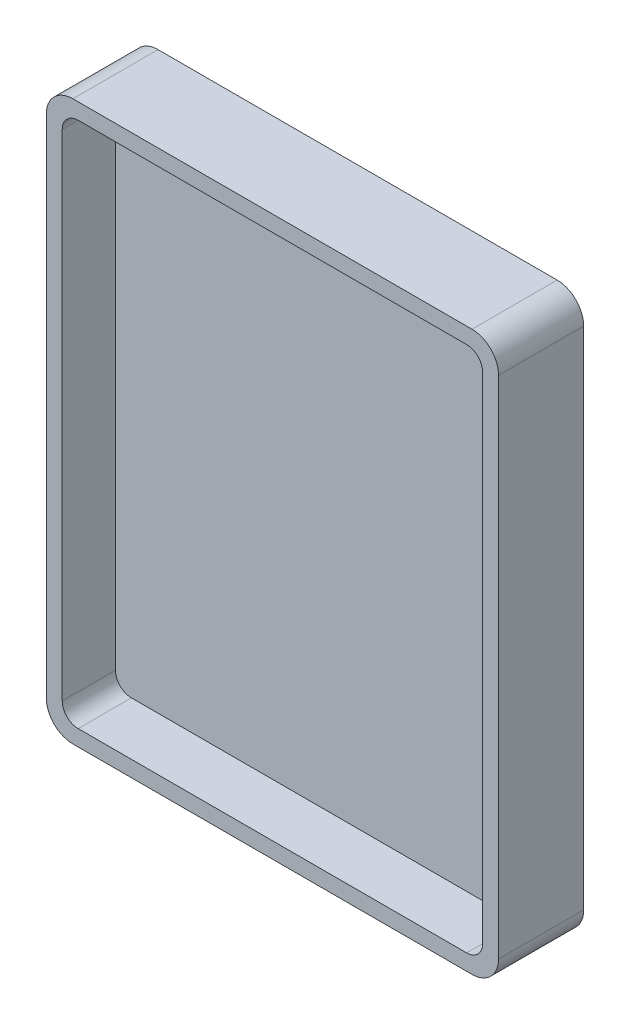
ISO-10303-21;
HEADER;
FILE_DESCRIPTION(('STEP AP214'),'2;1');
FILE_NAME('part.step','',(''),(''),'','','');
FILE_SCHEMA(('AUTOMOTIVE_DESIGN { 1 0 10303 214 1 1 1 1 }'));
ENDSEC;
DATA;
#1=APPLICATION_CONTEXT('core data for automotive mechanical design processes');
#2=APPLICATION_PROTOCOL_DEFINITION('international standard','automotive_design',2000,#1);
#3=PRODUCT_CONTEXT('',#1,'mechanical');
#4=PRODUCT('Part','Part','',(#3));
#5=PRODUCT_RELATED_PRODUCT_CATEGORY('part','',(#4));
#6=PRODUCT_DEFINITION_FORMATION('','',#4);
#7=PRODUCT_DEFINITION_CONTEXT('part definition',#1,'design');
#8=PRODUCT_DEFINITION('design','',#6,#7);
#9=PRODUCT_DEFINITION_SHAPE('','',#8);
#10=(LENGTH_UNIT() NAMED_UNIT(*) SI_UNIT(.MILLI.,.METRE.));
#11=(NAMED_UNIT(*) PLANE_ANGLE_UNIT() SI_UNIT($,.RADIAN.));
#12=(NAMED_UNIT(*) SI_UNIT($,.STERADIAN.) SOLID_ANGLE_UNIT());
#13=UNCERTAINTY_MEASURE_WITH_UNIT(LENGTH_MEASURE(1.E-05),#10,'distance_accuracy_value','');
#14=(GEOMETRIC_REPRESENTATION_CONTEXT(3) GLOBAL_UNCERTAINTY_ASSIGNED_CONTEXT((#13)) GLOBAL_UNIT_ASSIGNED_CONTEXT((#10,
#11,#12)) REPRESENTATION_CONTEXT('',''));
#15=CARTESIAN_POINT('',(0.,0.,0.));
#16=DIRECTION('',(0.,0.,1.));
#17=DIRECTION('',(1.,0.,0.));
#18=AXIS2_PLACEMENT_3D('',#15,#16,#17);
#19=CARTESIAN_POINT('',(-55.,65.,16.));
#20=DIRECTION('',(1.,0.,0.));
#21=DIRECTION('',(0.,1.,0.));
#22=AXIS2_PLACEMENT_3D('',#19,#20,#21);
#23=PLANE('',#22);
#24=DIRECTION('',(0.,-1.,0.));
#25=VECTOR('',#24,1.);
#26=CARTESIAN_POINT('',(-55.,65.,16.));
#27=LINE('',#26,#25);
#28=CARTESIAN_POINT('',(-55.,60.,16.));
#29=VERTEX_POINT('',#28);
#30=CARTESIAN_POINT('',(-55.,-35.,16.));
#31=VERTEX_POINT('',#30);
#32=EDGE_CURVE('E194',#29,#31,#27,.T.);
#33=ORIENTED_EDGE('',*,*,#32,.F.);
#34=DIRECTION('',(0.,0.,-1.));
#35=VECTOR('',#34,1.);
#36=CARTESIAN_POINT('',(-55.,60.,16.));
#37=LINE('',#36,#35);
#38=CARTESIAN_POINT('',(-55.,60.,0.));
#39=VERTEX_POINT('',#38);
#40=EDGE_CURVE('E237',#29,#39,#37,.T.);
#41=ORIENTED_EDGE('',*,*,#40,.T.);
#42=DIRECTION('',(0.,-1.,0.));
#43=VECTOR('',#42,1.);
#44=CARTESIAN_POINT('',(-55.,65.,0.));
#45=LINE('',#44,#43);
#46=CARTESIAN_POINT('',(-55.,-35.,0.));
#47=VERTEX_POINT('',#46);
#48=EDGE_CURVE('E196',#39,#47,#45,.T.);
#49=ORIENTED_EDGE('',*,*,#48,.T.);
#50=DIRECTION('',(0.,0.,-1.));
#51=VECTOR('',#50,1.);
#52=CARTESIAN_POINT('',(-55.,-35.,16.));
#53=LINE('',#52,#51);
#54=EDGE_CURVE('E234',#47,#31,#53,.F.);
#55=ORIENTED_EDGE('',*,*,#54,.T.);
#56=EDGE_LOOP('',(#33,#41,#49,#55));
#57=FACE_BOUND('',#56,.T.);
#58=ADVANCED_FACE('F46',(#57),#23,.F.);
#59=CARTESIAN_POINT('',(-55.,-40.,16.));
#60=DIRECTION('',(0.,1.,0.));
#61=DIRECTION('',(0.,0.,1.));
#62=AXIS2_PLACEMENT_3D('',#59,#60,#61);
#63=PLANE('',#62);
#64=DIRECTION('',(1.,0.,0.));
#65=VECTOR('',#64,1.);
#66=CARTESIAN_POINT('',(-55.,-40.,0.));
#67=LINE('',#66,#65);
#68=CARTESIAN_POINT('',(-50.,-40.,0.));
#69=VERTEX_POINT('',#68);
#70=CARTESIAN_POINT('',(25.,-40.,0.));
#71=VERTEX_POINT('',#70);
#72=EDGE_CURVE('E189',#69,#71,#67,.T.);
#73=ORIENTED_EDGE('',*,*,#72,.T.);
#74=DIRECTION('',(0.,0.,-1.));
#75=VECTOR('',#74,1.);
#76=CARTESIAN_POINT('',(25.,-40.,16.));
#77=LINE('',#76,#75);
#78=CARTESIAN_POINT('',(25.,-40.,16.));
#79=VERTEX_POINT('',#78);
#80=EDGE_CURVE('E164',#71,#79,#77,.F.);
#81=ORIENTED_EDGE('',*,*,#80,.T.);
#82=DIRECTION('',(1.,0.,0.));
#83=VECTOR('',#82,1.);
#84=CARTESIAN_POINT('',(-55.,-40.,16.));
#85=LINE('',#84,#83);
#86=CARTESIAN_POINT('',(-50.,-40.,16.));
#87=VERTEX_POINT('',#86);
#88=EDGE_CURVE('E301',#87,#79,#85,.T.);
#89=ORIENTED_EDGE('',*,*,#88,.F.);
#90=DIRECTION('',(0.,0.,-1.));
#91=VECTOR('',#90,1.);
#92=CARTESIAN_POINT('',(-50.,-40.,16.));
#93=LINE('',#92,#91);
#94=EDGE_CURVE('E170',#87,#69,#93,.T.);
#95=ORIENTED_EDGE('',*,*,#94,.T.);
#96=EDGE_LOOP('',(#73,#81,#89,#95));
#97=FACE_BOUND('',#96,.T.);
#98=ADVANCED_FACE('F421',(#97),#63,.F.);
#99=CARTESIAN_POINT('',(30.,65.,16.));
#100=DIRECTION('',(-1.,0.,0.));
#101=DIRECTION('',(0.,-1.,0.));
#102=AXIS2_PLACEMENT_3D('',#99,#100,#101);
#103=PLANE('',#102);
#104=DIRECTION('',(0.,1.,0.));
#105=VECTOR('',#104,1.);
#106=CARTESIAN_POINT('',(30.,65.,16.));
#107=LINE('',#106,#105);
#108=CARTESIAN_POINT('',(30.,-35.,16.));
#109=VERTEX_POINT('',#108);
#110=CARTESIAN_POINT('',(30.,60.,16.));
#111=VERTEX_POINT('',#110);
#112=EDGE_CURVE('E180',#109,#111,#107,.T.);
#113=ORIENTED_EDGE('',*,*,#112,.F.);
#114=DIRECTION('',(0.,0.,-1.));
#115=VECTOR('',#114,1.);
#116=CARTESIAN_POINT('',(30.,-35.,16.));
#117=LINE('',#116,#115);
#118=CARTESIAN_POINT('',(30.,-35.,0.));
#119=VERTEX_POINT('',#118);
#120=EDGE_CURVE('E163',#109,#119,#117,.T.);
#121=ORIENTED_EDGE('',*,*,#120,.T.);
#122=DIRECTION('',(0.,1.,0.));
#123=VECTOR('',#122,1.);
#124=CARTESIAN_POINT('',(30.,65.,0.));
#125=LINE('',#124,#123);
#126=CARTESIAN_POINT('',(30.,60.,0.));
#127=VERTEX_POINT('',#126);
#128=EDGE_CURVE('E177',#119,#127,#125,.T.);
#129=ORIENTED_EDGE('',*,*,#128,.T.);
#130=DIRECTION('',(0.,0.,-1.));
#131=VECTOR('',#130,1.);
#132=CARTESIAN_POINT('',(30.,60.,16.));
#133=LINE('',#132,#131);
#134=EDGE_CURVE('E183',#127,#111,#133,.F.);
#135=ORIENTED_EDGE('',*,*,#134,.T.);
#136=EDGE_LOOP('',(#113,#121,#129,#135));
#137=FACE_BOUND('',#136,.T.);
#138=ADVANCED_FACE('F176',(#137),#103,.F.);
#139=CARTESIAN_POINT('',(-55.,65.,16.));
#140=DIRECTION('',(0.,-1.,0.));
#141=DIRECTION('',(0.,0.,-1.));
#142=AXIS2_PLACEMENT_3D('',#139,#140,#141);
#143=PLANE('',#142);
#144=DIRECTION('',(-1.,0.,0.));
#145=VECTOR('',#144,1.);
#146=CARTESIAN_POINT('',(-55.,65.,16.));
#147=LINE('',#146,#145);
#148=CARTESIAN_POINT('',(25.,65.,16.));
#149=VERTEX_POINT('',#148);
#150=CARTESIAN_POINT('',(-50.,65.,16.));
#151=VERTEX_POINT('',#150);
#152=EDGE_CURVE('E201',#149,#151,#147,.T.);
#153=ORIENTED_EDGE('',*,*,#152,.F.);
#154=DIRECTION('',(0.,0.,-1.));
#155=VECTOR('',#154,1.);
#156=CARTESIAN_POINT('',(25.,65.,16.));
#157=LINE('',#156,#155);
#158=CARTESIAN_POINT('',(25.,65.,0.));
#159=VERTEX_POINT('',#158);
#160=EDGE_CURVE('E230',#149,#159,#157,.T.);
#161=ORIENTED_EDGE('',*,*,#160,.T.);
#162=DIRECTION('',(-1.,0.,0.));
#163=VECTOR('',#162,1.);
#164=CARTESIAN_POINT('',(-55.,65.,0.));
#165=LINE('',#164,#163);
#166=CARTESIAN_POINT('',(-50.,65.,0.));
#167=VERTEX_POINT('',#166);
#168=EDGE_CURVE('E188',#159,#167,#165,.T.);
#169=ORIENTED_EDGE('',*,*,#168,.T.);
#170=DIRECTION('',(0.,0.,-1.));
#171=VECTOR('',#170,1.);
#172=CARTESIAN_POINT('',(-50.,65.,16.));
#173=LINE('',#172,#171);
#174=EDGE_CURVE('E227',#167,#151,#173,.F.);
#175=ORIENTED_EDGE('',*,*,#174,.T.);
#176=EDGE_LOOP('',(#153,#161,#169,#175));
#177=FACE_BOUND('',#176,.T.);
#178=ADVANCED_FACE('F468',(#177),#143,.F.);
#179=CARTESIAN_POINT('',(0.,0.,16.));
#180=DIRECTION('',(0.,0.,1.));
#181=DIRECTION('',(1.,0.,0.));
#182=AXIS2_PLACEMENT_3D('',#179,#180,#181);
#183=PLANE('',#182);
#184=DIRECTION('',(0.,-1.,0.));
#185=VECTOR('',#184,1.);
#186=CARTESIAN_POINT('',(-52.,62.,16.));
#187=LINE('',#186,#185);
#188=CARTESIAN_POINT('',(-52.,59.,16.));
#189=VERTEX_POINT('',#188);
#190=CARTESIAN_POINT('',(-52.,-34.,16.));
#191=VERTEX_POINT('',#190);
#192=EDGE_CURVE('E333',#189,#191,#187,.T.);
#193=ORIENTED_EDGE('',*,*,#192,.F.);
#194=CARTESIAN_POINT('',(-49.,59.,16.));
#195=DIRECTION('',(0.,0.,1.));
#196=DIRECTION('',(1.,0.,0.));
#197=AXIS2_PLACEMENT_3D('',#194,#195,#196);
#198=CIRCLE('',#197,3.);
#199=CARTESIAN_POINT('',(-49.,62.,16.));
#200=VERTEX_POINT('',#199);
#201=EDGE_CURVE('E11',#189,#200,#198,.F.);
#202=ORIENTED_EDGE('',*,*,#201,.T.);
#203=DIRECTION('',(-1.,0.,0.));
#204=VECTOR('',#203,1.);
#205=CARTESIAN_POINT('',(-52.,62.,16.));
#206=LINE('',#205,#204);
#207=CARTESIAN_POINT('',(24.,62.,16.));
#208=VERTEX_POINT('',#207);
#209=EDGE_CURVE('E312',#208,#200,#206,.T.);
#210=ORIENTED_EDGE('',*,*,#209,.F.);
#211=CARTESIAN_POINT('',(24.,59.,16.));
#212=DIRECTION('',(0.,0.,1.));
#213=DIRECTION('',(1.,0.,0.));
#214=AXIS2_PLACEMENT_3D('',#211,#212,#213);
#215=CIRCLE('',#214,3.);
#216=CARTESIAN_POINT('',(27.,59.,16.));
#217=VERTEX_POINT('',#216);
#218=EDGE_CURVE('E290',#208,#217,#215,.F.);
#219=ORIENTED_EDGE('',*,*,#218,.T.);
#220=DIRECTION('',(0.,1.,0.));
#221=VECTOR('',#220,1.);
#222=CARTESIAN_POINT('',(27.,62.,16.));
#223=LINE('',#222,#221);
#224=CARTESIAN_POINT('',(27.,-34.,16.));
#225=VERTEX_POINT('',#224);
#226=EDGE_CURVE('E340',#225,#217,#223,.T.);
#227=ORIENTED_EDGE('',*,*,#226,.F.);
#228=CARTESIAN_POINT('',(24.,-34.,16.));
#229=DIRECTION('',(0.,0.,1.));
#230=DIRECTION('',(1.,0.,0.));
#231=AXIS2_PLACEMENT_3D('',#228,#229,#230);
#232=CIRCLE('',#231,3.);
#233=CARTESIAN_POINT('',(24.,-37.,16.));
#234=VERTEX_POINT('',#233);
#235=EDGE_CURVE('E293',#225,#234,#232,.F.);
#236=ORIENTED_EDGE('',*,*,#235,.T.);
#237=DIRECTION('',(1.,0.,0.));
#238=VECTOR('',#237,1.);
#239=CARTESIAN_POINT('',(-52.,-37.,16.));
#240=LINE('',#239,#238);
#241=CARTESIAN_POINT('',(-49.,-37.,16.));
#242=VERTEX_POINT('',#241);
#243=EDGE_CURVE('E336',#242,#234,#240,.T.);
#244=ORIENTED_EDGE('',*,*,#243,.F.);
#245=CARTESIAN_POINT('',(-49.,-34.,16.));
#246=DIRECTION('',(0.,0.,1.));
#247=DIRECTION('',(1.,0.,0.));
#248=AXIS2_PLACEMENT_3D('',#245,#246,#247);
#249=CIRCLE('',#248,3.);
#250=EDGE_CURVE('E55',#242,#191,#249,.F.);
#251=ORIENTED_EDGE('',*,*,#250,.T.);
#252=EDGE_LOOP('',(#193,#202,#210,#219,#227,#236,#244,#251));
#253=FACE_BOUND('',#252,.T.);
#254=ORIENTED_EDGE('',*,*,#88,.T.);
#255=CARTESIAN_POINT('',(25.,-35.,16.));
#256=DIRECTION('',(0.,0.,1.));
#257=DIRECTION('',(1.,0.,0.));
#258=AXIS2_PLACEMENT_3D('',#255,#256,#257);
#259=CIRCLE('',#258,5.);
#260=EDGE_CURVE('E224',#79,#109,#259,.T.);
#261=ORIENTED_EDGE('',*,*,#260,.T.);
#262=ORIENTED_EDGE('',*,*,#112,.T.);
#263=CARTESIAN_POINT('',(25.,60.,16.));
#264=DIRECTION('',(0.,0.,1.));
#265=DIRECTION('',(1.,0.,0.));
#266=AXIS2_PLACEMENT_3D('',#263,#264,#265);
#267=CIRCLE('',#266,5.);
#268=EDGE_CURVE('E221',#111,#149,#267,.T.);
#269=ORIENTED_EDGE('',*,*,#268,.T.);
#270=ORIENTED_EDGE('',*,*,#152,.T.);
#271=CARTESIAN_POINT('',(-50.,60.,16.));
#272=DIRECTION('',(0.,0.,1.));
#273=DIRECTION('',(1.,0.,0.));
#274=AXIS2_PLACEMENT_3D('',#271,#272,#273);
#275=CIRCLE('',#274,5.);
#276=EDGE_CURVE('E218',#151,#29,#275,.T.);
#277=ORIENTED_EDGE('',*,*,#276,.T.);
#278=ORIENTED_EDGE('',*,*,#32,.T.);
#279=CARTESIAN_POINT('',(-50.,-35.,16.));
#280=DIRECTION('',(0.,0.,1.));
#281=DIRECTION('',(1.,0.,0.));
#282=AXIS2_PLACEMENT_3D('',#279,#280,#281);
#283=CIRCLE('',#282,5.);
#284=EDGE_CURVE('E215',#31,#87,#283,.T.);
#285=ORIENTED_EDGE('',*,*,#284,.T.);
#286=EDGE_LOOP('',(#254,#261,#262,#269,#270,#277,#278,#285));
#287=FACE_BOUND('',#286,.T.);
#288=ADVANCED_FACE('F400',(#253,#287),#183,.T.);
#289=CARTESIAN_POINT('',(0.,0.,0.));
#290=DIRECTION('',(0.,0.,1.));
#291=DIRECTION('',(1.,0.,0.));
#292=AXIS2_PLACEMENT_3D('',#289,#290,#291);
#293=PLANE('',#292);
#294=CARTESIAN_POINT('',(-48.5,58.5,0.));
#295=DIRECTION('',(0.,0.,-1.));
#296=DIRECTION('',(-1.,0.,0.));
#297=AXIS2_PLACEMENT_3D('',#294,#295,#296);
#298=CIRCLE('',#297,2.);
#299=CARTESIAN_POINT('',(-50.5,58.5,0.));
#300=VERTEX_POINT('',#299);
#301=EDGE_CURVE('E366',#300,#300,#298,.T.);
#302=ORIENTED_EDGE('',*,*,#301,.F.);
#303=EDGE_LOOP('',(#302));
#304=FACE_BOUND('',#303,.T.);
#305=CARTESIAN_POINT('',(23.5,-33.5,0.));
#306=DIRECTION('',(0.,0.,-1.));
#307=DIRECTION('',(-1.,0.,0.));
#308=AXIS2_PLACEMENT_3D('',#305,#306,#307);
#309=CIRCLE('',#308,2.);
#310=CARTESIAN_POINT('',(21.5,-33.5,0.));
#311=VERTEX_POINT('',#310);
#312=EDGE_CURVE('E251',#311,#311,#309,.T.);
#313=ORIENTED_EDGE('',*,*,#312,.F.);
#314=EDGE_LOOP('',(#313));
#315=FACE_BOUND('',#314,.T.);
#316=ORIENTED_EDGE('',*,*,#128,.F.);
#317=CARTESIAN_POINT('',(25.,-35.,0.));
#318=DIRECTION('',(0.,0.,1.));
#319=DIRECTION('',(1.,0.,0.));
#320=AXIS2_PLACEMENT_3D('',#317,#318,#319);
#321=CIRCLE('',#320,5.);
#322=EDGE_CURVE('E159',#119,#71,#321,.F.);
#323=ORIENTED_EDGE('',*,*,#322,.T.);
#324=ORIENTED_EDGE('',*,*,#72,.F.);
#325=CARTESIAN_POINT('',(-50.,-35.,0.));
#326=DIRECTION('',(0.,0.,1.));
#327=DIRECTION('',(1.,0.,0.));
#328=AXIS2_PLACEMENT_3D('',#325,#326,#327);
#329=CIRCLE('',#328,5.);
#330=EDGE_CURVE('E182',#69,#47,#329,.F.);
#331=ORIENTED_EDGE('',*,*,#330,.T.);
#332=ORIENTED_EDGE('',*,*,#48,.F.);
#333=CARTESIAN_POINT('',(-50.,60.,0.));
#334=DIRECTION('',(0.,0.,1.));
#335=DIRECTION('',(1.,0.,0.));
#336=AXIS2_PLACEMENT_3D('',#333,#334,#335);
#337=CIRCLE('',#336,5.);
#338=EDGE_CURVE('E205',#39,#167,#337,.F.);
#339=ORIENTED_EDGE('',*,*,#338,.T.);
#340=ORIENTED_EDGE('',*,*,#168,.F.);
#341=CARTESIAN_POINT('',(25.,60.,0.));
#342=DIRECTION('',(0.,0.,1.));
#343=DIRECTION('',(1.,0.,0.));
#344=AXIS2_PLACEMENT_3D('',#341,#342,#343);
#345=CIRCLE('',#344,5.);
#346=EDGE_CURVE('E171',#159,#127,#345,.F.);
#347=ORIENTED_EDGE('',*,*,#346,.T.);
#348=EDGE_LOOP('',(#316,#323,#324,#331,#332,#339,#340,#347));
#349=FACE_BOUND('',#348,.T.);
#350=ADVANCED_FACE('F185',(#304,#315,#349),#293,.F.);
#351=CARTESIAN_POINT('',(-52.,62.,6.));
#352=DIRECTION('',(-1.,0.,0.));
#353=DIRECTION('',(0.,-1.,0.));
#354=AXIS2_PLACEMENT_3D('',#351,#352,#353);
#355=PLANE('',#354);
#356=ORIENTED_EDGE('',*,*,#192,.T.);
#357=DIRECTION('',(0.,0.,1.));
#358=VECTOR('',#357,1.);
#359=CARTESIAN_POINT('',(-52.,-34.,6.));
#360=LINE('',#359,#358);
#361=CARTESIAN_POINT('',(-52.,-34.,6.));
#362=VERTEX_POINT('',#361);
#363=EDGE_CURVE('E287',#191,#362,#360,.F.);
#364=ORIENTED_EDGE('',*,*,#363,.T.);
#365=DIRECTION('',(0.,-1.,0.));
#366=VECTOR('',#365,1.);
#367=CARTESIAN_POINT('',(-52.,62.,6.));
#368=LINE('',#367,#366);
#369=CARTESIAN_POINT('',(-52.,59.,6.));
#370=VERTEX_POINT('',#369);
#371=EDGE_CURVE('E348',#370,#362,#368,.T.);
#372=ORIENTED_EDGE('',*,*,#371,.F.);
#373=DIRECTION('',(0.,0.,1.));
#374=VECTOR('',#373,1.);
#375=CARTESIAN_POINT('',(-52.,59.,16.));
#376=LINE('',#375,#374);
#377=EDGE_CURVE('E284',#370,#189,#376,.T.);
#378=ORIENTED_EDGE('',*,*,#377,.T.);
#379=EDGE_LOOP('',(#356,#364,#372,#378));
#380=FACE_BOUND('',#379,.T.);
#381=ADVANCED_FACE('F399',(#380),#355,.F.);
#382=CARTESIAN_POINT('',(-52.,62.,6.));
#383=DIRECTION('',(0.,1.,0.));
#384=DIRECTION('',(0.,0.,1.));
#385=AXIS2_PLACEMENT_3D('',#382,#383,#384);
#386=PLANE('',#385);
#387=DIRECTION('',(-1.,0.,0.));
#388=VECTOR('',#387,1.);
#389=CARTESIAN_POINT('',(-52.,62.,6.));
#390=LINE('',#389,#388);
#391=CARTESIAN_POINT('',(24.,62.,6.));
#392=VERTEX_POINT('',#391);
#393=CARTESIAN_POINT('',(-49.,62.,6.));
#394=VERTEX_POINT('',#393);
#395=EDGE_CURVE('E316',#392,#394,#390,.T.);
#396=ORIENTED_EDGE('',*,*,#395,.F.);
#397=DIRECTION('',(0.,0.,1.));
#398=VECTOR('',#397,1.);
#399=CARTESIAN_POINT('',(24.,62.,16.));
#400=LINE('',#399,#398);
#401=EDGE_CURVE('E254',#392,#208,#400,.T.);
#402=ORIENTED_EDGE('',*,*,#401,.T.);
#403=ORIENTED_EDGE('',*,*,#209,.T.);
#404=DIRECTION('',(0.,0.,1.));
#405=VECTOR('',#404,1.);
#406=CARTESIAN_POINT('',(-49.,62.,6.));
#407=LINE('',#406,#405);
#408=EDGE_CURVE('E241',#200,#394,#407,.F.);
#409=ORIENTED_EDGE('',*,*,#408,.T.);
#410=EDGE_LOOP('',(#396,#402,#403,#409));
#411=FACE_BOUND('',#410,.T.);
#412=ADVANCED_FACE('F465',(#411),#386,.F.);
#413=CARTESIAN_POINT('',(27.,62.,6.));
#414=DIRECTION('',(1.,0.,0.));
#415=DIRECTION('',(0.,1.,0.));
#416=AXIS2_PLACEMENT_3D('',#413,#414,#415);
#417=PLANE('',#416);
#418=ORIENTED_EDGE('',*,*,#226,.T.);
#419=DIRECTION('',(0.,0.,1.));
#420=VECTOR('',#419,1.);
#421=CARTESIAN_POINT('',(27.,59.,6.));
#422=LINE('',#421,#420);
#423=CARTESIAN_POINT('',(27.,59.,6.));
#424=VERTEX_POINT('',#423);
#425=EDGE_CURVE('E262',#217,#424,#422,.F.);
#426=ORIENTED_EDGE('',*,*,#425,.T.);
#427=DIRECTION('',(0.,1.,0.));
#428=VECTOR('',#427,1.);
#429=CARTESIAN_POINT('',(27.,62.,6.));
#430=LINE('',#429,#428);
#431=CARTESIAN_POINT('',(27.,-34.,6.));
#432=VERTEX_POINT('',#431);
#433=EDGE_CURVE('E322',#432,#424,#430,.T.);
#434=ORIENTED_EDGE('',*,*,#433,.F.);
#435=DIRECTION('',(0.,0.,1.));
#436=VECTOR('',#435,1.);
#437=CARTESIAN_POINT('',(27.,-34.,16.));
#438=LINE('',#437,#436);
#439=EDGE_CURVE('E258',#432,#225,#438,.T.);
#440=ORIENTED_EDGE('',*,*,#439,.T.);
#441=EDGE_LOOP('',(#418,#426,#434,#440));
#442=FACE_BOUND('',#441,.T.);
#443=ADVANCED_FACE('F463',(#442),#417,.F.);
#444=CARTESIAN_POINT('',(-52.,-37.,6.));
#445=DIRECTION('',(0.,-1.,0.));
#446=DIRECTION('',(0.,0.,-1.));
#447=AXIS2_PLACEMENT_3D('',#444,#445,#446);
#448=PLANE('',#447);
#449=ORIENTED_EDGE('',*,*,#243,.T.);
#450=DIRECTION('',(0.,0.,1.));
#451=VECTOR('',#450,1.);
#452=CARTESIAN_POINT('',(24.,-37.,6.));
#453=LINE('',#452,#451);
#454=CARTESIAN_POINT('',(24.,-37.,6.));
#455=VERTEX_POINT('',#454);
#456=EDGE_CURVE('E281',#234,#455,#453,.F.);
#457=ORIENTED_EDGE('',*,*,#456,.T.);
#458=DIRECTION('',(1.,0.,0.));
#459=VECTOR('',#458,1.);
#460=CARTESIAN_POINT('',(-52.,-37.,6.));
#461=LINE('',#460,#459);
#462=CARTESIAN_POINT('',(-49.,-37.,6.));
#463=VERTEX_POINT('',#462);
#464=EDGE_CURVE('E329',#463,#455,#461,.T.);
#465=ORIENTED_EDGE('',*,*,#464,.F.);
#466=DIRECTION('',(0.,0.,1.));
#467=VECTOR('',#466,1.);
#468=CARTESIAN_POINT('',(-49.,-37.,16.));
#469=LINE('',#468,#467);
#470=EDGE_CURVE('E277',#463,#242,#469,.T.);
#471=ORIENTED_EDGE('',*,*,#470,.T.);
#472=EDGE_LOOP('',(#449,#457,#465,#471));
#473=FACE_BOUND('',#472,.T.);
#474=ADVANCED_FACE('F458',(#473),#448,.F.);
#475=CARTESIAN_POINT('',(0.,0.,6.));
#476=DIRECTION('',(0.,0.,1.));
#477=DIRECTION('',(1.,0.,0.));
#478=AXIS2_PLACEMENT_3D('',#475,#476,#477);
#479=PLANE('',#478);
#480=CARTESIAN_POINT('',(-48.5,58.5,6.));
#481=DIRECTION('',(0.,0.,1.));
#482=DIRECTION('',(1.,0.,0.));
#483=AXIS2_PLACEMENT_3D('',#480,#481,#482);
#484=CIRCLE('',#483,1.35);
#485=CARTESIAN_POINT('',(-49.85,58.5,6.));
#486=VERTEX_POINT('',#485);
#487=EDGE_CURVE('E246',#486,#486,#484,.T.);
#488=ORIENTED_EDGE('',*,*,#487,.F.);
#489=EDGE_LOOP('',(#488));
#490=FACE_BOUND('',#489,.T.);
#491=CARTESIAN_POINT('',(23.5,-33.5,6.));
#492=DIRECTION('',(0.,0.,1.));
#493=DIRECTION('',(1.,0.,0.));
#494=AXIS2_PLACEMENT_3D('',#491,#492,#493);
#495=CIRCLE('',#494,1.35);
#496=CARTESIAN_POINT('',(22.15,-33.5,6.));
#497=VERTEX_POINT('',#496);
#498=EDGE_CURVE('E242',#497,#497,#495,.T.);
#499=ORIENTED_EDGE('',*,*,#498,.F.);
#500=EDGE_LOOP('',(#499));
#501=FACE_BOUND('',#500,.T.);
#502=ORIENTED_EDGE('',*,*,#433,.T.);
#503=CARTESIAN_POINT('',(24.,59.,6.));
#504=DIRECTION('',(0.,0.,1.));
#505=DIRECTION('',(1.,0.,0.));
#506=AXIS2_PLACEMENT_3D('',#503,#504,#505);
#507=CIRCLE('',#506,3.);
#508=EDGE_CURVE('E274',#424,#392,#507,.T.);
#509=ORIENTED_EDGE('',*,*,#508,.T.);
#510=ORIENTED_EDGE('',*,*,#395,.T.);
#511=CARTESIAN_POINT('',(-49.,59.,6.));
#512=DIRECTION('',(0.,0.,1.));
#513=DIRECTION('',(1.,0.,0.));
#514=AXIS2_PLACEMENT_3D('',#511,#512,#513);
#515=CIRCLE('',#514,3.);
#516=EDGE_CURVE('E265',#394,#370,#515,.T.);
#517=ORIENTED_EDGE('',*,*,#516,.T.);
#518=ORIENTED_EDGE('',*,*,#371,.T.);
#519=CARTESIAN_POINT('',(-49.,-34.,6.));
#520=DIRECTION('',(0.,0.,1.));
#521=DIRECTION('',(1.,0.,0.));
#522=AXIS2_PLACEMENT_3D('',#519,#520,#521);
#523=CIRCLE('',#522,3.);
#524=EDGE_CURVE('E268',#362,#463,#523,.T.);
#525=ORIENTED_EDGE('',*,*,#524,.T.);
#526=ORIENTED_EDGE('',*,*,#464,.T.);
#527=CARTESIAN_POINT('',(24.,-34.,6.));
#528=DIRECTION('',(0.,0.,1.));
#529=DIRECTION('',(1.,0.,0.));
#530=AXIS2_PLACEMENT_3D('',#527,#528,#529);
#531=CIRCLE('',#530,3.);
#532=EDGE_CURVE('E271',#455,#432,#531,.T.);
#533=ORIENTED_EDGE('',*,*,#532,.T.);
#534=EDGE_LOOP('',(#502,#509,#510,#517,#518,#525,#526,#533));
#535=FACE_BOUND('',#534,.T.);
#536=ADVANCED_FACE('F433',(#490,#501,#535),#479,.T.);
#537=CARTESIAN_POINT('',(25.,-35.,16.));
#538=DIRECTION('',(0.,0.,-1.));
#539=DIRECTION('',(-1.,0.,0.));
#540=AXIS2_PLACEMENT_3D('',#537,#538,#539);
#541=CYLINDRICAL_SURFACE('',#540,5.);
#542=ORIENTED_EDGE('',*,*,#260,.F.);
#543=ORIENTED_EDGE('',*,*,#80,.F.);
#544=ORIENTED_EDGE('',*,*,#322,.F.);
#545=ORIENTED_EDGE('',*,*,#120,.F.);
#546=EDGE_LOOP('',(#542,#543,#544,#545));
#547=FACE_BOUND('',#546,.T.);
#548=ADVANCED_FACE('F162',(#547),#541,.T.);
#549=CARTESIAN_POINT('',(25.,60.,16.));
#550=DIRECTION('',(0.,0.,-1.));
#551=DIRECTION('',(-1.,0.,0.));
#552=AXIS2_PLACEMENT_3D('',#549,#550,#551);
#553=CYLINDRICAL_SURFACE('',#552,5.);
#554=ORIENTED_EDGE('',*,*,#268,.F.);
#555=ORIENTED_EDGE('',*,*,#134,.F.);
#556=ORIENTED_EDGE('',*,*,#346,.F.);
#557=ORIENTED_EDGE('',*,*,#160,.F.);
#558=EDGE_LOOP('',(#554,#555,#556,#557));
#559=FACE_BOUND('',#558,.T.);
#560=ADVANCED_FACE('F432',(#559),#553,.T.);
#561=CARTESIAN_POINT('',(-50.,60.,16.));
#562=DIRECTION('',(0.,0.,-1.));
#563=DIRECTION('',(-1.,0.,0.));
#564=AXIS2_PLACEMENT_3D('',#561,#562,#563);
#565=CYLINDRICAL_SURFACE('',#564,5.);
#566=ORIENTED_EDGE('',*,*,#276,.F.);
#567=ORIENTED_EDGE('',*,*,#174,.F.);
#568=ORIENTED_EDGE('',*,*,#338,.F.);
#569=ORIENTED_EDGE('',*,*,#40,.F.);
#570=EDGE_LOOP('',(#566,#567,#568,#569));
#571=FACE_BOUND('',#570,.T.);
#572=ADVANCED_FACE('F415',(#571),#565,.T.);
#573=CARTESIAN_POINT('',(-50.,-35.,16.));
#574=DIRECTION('',(0.,0.,-1.));
#575=DIRECTION('',(-1.,0.,0.));
#576=AXIS2_PLACEMENT_3D('',#573,#574,#575);
#577=CYLINDRICAL_SURFACE('',#576,5.);
#578=ORIENTED_EDGE('',*,*,#284,.F.);
#579=ORIENTED_EDGE('',*,*,#54,.F.);
#580=ORIENTED_EDGE('',*,*,#330,.F.);
#581=ORIENTED_EDGE('',*,*,#94,.F.);
#582=EDGE_LOOP('',(#578,#579,#580,#581));
#583=FACE_BOUND('',#582,.T.);
#584=ADVANCED_FACE('F406',(#583),#577,.T.);
#585=CARTESIAN_POINT('',(23.5,-33.5,1.5));
#586=DIRECTION('',(0.,0.,-1.));
#587=DIRECTION('',(-1.,0.,0.));
#588=AXIS2_PLACEMENT_3D('',#585,#586,#587);
#589=CYLINDRICAL_SURFACE('',#588,2.);
#590=CARTESIAN_POINT('',(23.5,-33.5,1.5));
#591=DIRECTION('',(0.,0.,-1.));
#592=DIRECTION('',(-1.,0.,0.));
#593=AXIS2_PLACEMENT_3D('',#590,#591,#592);
#594=CIRCLE('',#593,2.);
#595=CARTESIAN_POINT('',(21.5,-33.5,1.5));
#596=VERTEX_POINT('',#595);
#597=EDGE_CURVE('E362',#596,#596,#594,.T.);
#598=ORIENTED_EDGE('',*,*,#597,.F.);
#599=EDGE_LOOP('',(#598));
#600=FACE_BOUND('',#599,.T.);
#601=ORIENTED_EDGE('',*,*,#312,.T.);
#602=EDGE_LOOP('',(#601));
#603=FACE_BOUND('',#602,.T.);
#604=ADVANCED_FACE('F404',(#600,#603),#589,.F.);
#605=CARTESIAN_POINT('',(23.5,-33.5,1.5));
#606=DIRECTION('',(0.,0.,-1.));
#607=DIRECTION('',(-1.,0.,0.));
#608=AXIS2_PLACEMENT_3D('',#605,#606,#607);
#609=PLANE('',#608);
#610=CARTESIAN_POINT('',(23.5,-33.5,1.5));
#611=DIRECTION('',(0.,0.,-1.));
#612=DIRECTION('',(-1.,0.,0.));
#613=AXIS2_PLACEMENT_3D('',#610,#611,#612);
#614=CIRCLE('',#613,1.35);
#615=CARTESIAN_POINT('',(22.15,-33.5,1.5));
#616=VERTEX_POINT('',#615);
#617=EDGE_CURVE('E373',#616,#616,#614,.T.);
#618=ORIENTED_EDGE('',*,*,#617,.F.);
#619=EDGE_LOOP('',(#618));
#620=FACE_BOUND('',#619,.T.);
#621=ORIENTED_EDGE('',*,*,#597,.T.);
#622=EDGE_LOOP('',(#621));
#623=FACE_BOUND('',#622,.T.);
#624=ADVANCED_FACE('F393',(#620,#623),#609,.T.);
#625=CARTESIAN_POINT('',(-48.5,58.5,1.5));
#626=DIRECTION('',(0.,0.,-1.));
#627=DIRECTION('',(-1.,0.,0.));
#628=AXIS2_PLACEMENT_3D('',#625,#626,#627);
#629=CYLINDRICAL_SURFACE('',#628,2.);
#630=CARTESIAN_POINT('',(-48.5,58.5,1.5));
#631=DIRECTION('',(0.,0.,-1.));
#632=DIRECTION('',(-1.,0.,0.));
#633=AXIS2_PLACEMENT_3D('',#630,#631,#632);
#634=CIRCLE('',#633,2.);
#635=CARTESIAN_POINT('',(-50.5,58.5,1.5));
#636=VERTEX_POINT('',#635);
#637=EDGE_CURVE('E337',#636,#636,#634,.T.);
#638=ORIENTED_EDGE('',*,*,#637,.F.);
#639=EDGE_LOOP('',(#638));
#640=FACE_BOUND('',#639,.T.);
#641=ORIENTED_EDGE('',*,*,#301,.T.);
#642=EDGE_LOOP('',(#641));
#643=FACE_BOUND('',#642,.T.);
#644=ADVANCED_FACE('F387',(#640,#643),#629,.F.);
#645=CARTESIAN_POINT('',(-48.5,58.5,1.5));
#646=DIRECTION('',(0.,0.,-1.));
#647=DIRECTION('',(-1.,0.,0.));
#648=AXIS2_PLACEMENT_3D('',#645,#646,#647);
#649=PLANE('',#648);
#650=CARTESIAN_POINT('',(-48.5,58.5,1.5));
#651=DIRECTION('',(0.,0.,-1.));
#652=DIRECTION('',(-1.,0.,0.));
#653=AXIS2_PLACEMENT_3D('',#650,#651,#652);
#654=CIRCLE('',#653,1.35);
#655=CARTESIAN_POINT('',(-49.85,58.5,1.5));
#656=VERTEX_POINT('',#655);
#657=EDGE_CURVE('E247',#656,#656,#654,.T.);
#658=ORIENTED_EDGE('',*,*,#657,.F.);
#659=EDGE_LOOP('',(#658));
#660=FACE_BOUND('',#659,.T.);
#661=ORIENTED_EDGE('',*,*,#637,.T.);
#662=EDGE_LOOP('',(#661));
#663=FACE_BOUND('',#662,.T.);
#664=ADVANCED_FACE('F383',(#660,#663),#649,.T.);
#665=CARTESIAN_POINT('',(23.5,-33.5,16.));
#666=DIRECTION('',(0.,0.,-1.));
#667=DIRECTION('',(-1.,0.,0.));
#668=AXIS2_PLACEMENT_3D('',#665,#666,#667);
#669=CYLINDRICAL_SURFACE('',#668,1.35);
#670=CARTESIAN_POINT('',(22.15,-33.5,6.));
#671=CARTESIAN_POINT('',(22.15,-33.5,5.953125));
#672=CARTESIAN_POINT('',(22.15,-33.5,5.90625));
#673=CARTESIAN_POINT('',(22.15,-33.5,5.8125));
#674=CARTESIAN_POINT('',(22.15,-33.5,5.765625));
#675=CARTESIAN_POINT('',(22.15,-33.5,5.671875));
#676=CARTESIAN_POINT('',(22.15,-33.5,5.625));
#677=CARTESIAN_POINT('',(22.15,-33.5,5.53125));
#678=CARTESIAN_POINT('',(22.15,-33.5,5.484375));
#679=CARTESIAN_POINT('',(22.15,-33.5,5.390625));
#680=CARTESIAN_POINT('',(22.15,-33.5,5.34375));
#681=CARTESIAN_POINT('',(22.15,-33.5,5.25));
#682=CARTESIAN_POINT('',(22.15,-33.5,5.203125));
#683=CARTESIAN_POINT('',(22.15,-33.5,5.109375));
#684=CARTESIAN_POINT('',(22.15,-33.5,5.0625));
#685=CARTESIAN_POINT('',(22.15,-33.5,4.96875));
#686=CARTESIAN_POINT('',(22.15,-33.5,4.921875));
#687=CARTESIAN_POINT('',(22.15,-33.5,4.828125));
#688=CARTESIAN_POINT('',(22.15,-33.5,4.78125));
#689=CARTESIAN_POINT('',(22.15,-33.5,4.6875));
#690=CARTESIAN_POINT('',(22.15,-33.5,4.640625));
#691=CARTESIAN_POINT('',(22.15,-33.5,4.546875));
#692=CARTESIAN_POINT('',(22.15,-33.5,4.5));
#693=CARTESIAN_POINT('',(22.15,-33.5,4.40625));
#694=CARTESIAN_POINT('',(22.15,-33.5,4.359375));
#695=CARTESIAN_POINT('',(22.15,-33.5,4.265625));
#696=CARTESIAN_POINT('',(22.15,-33.5,4.21875));
#697=CARTESIAN_POINT('',(22.15,-33.5,4.125));
#698=CARTESIAN_POINT('',(22.15,-33.5,4.078125));
#699=CARTESIAN_POINT('',(22.15,-33.5,3.984375));
#700=CARTESIAN_POINT('',(22.15,-33.5,3.9375));
#701=CARTESIAN_POINT('',(22.15,-33.5,3.84375));
#702=CARTESIAN_POINT('',(22.15,-33.5,3.796875));
#703=CARTESIAN_POINT('',(22.15,-33.5,3.703125));
#704=CARTESIAN_POINT('',(22.15,-33.5,3.65625));
#705=CARTESIAN_POINT('',(22.15,-33.5,3.5625));
#706=CARTESIAN_POINT('',(22.15,-33.5,3.515625));
#707=CARTESIAN_POINT('',(22.15,-33.5,3.421875));
#708=CARTESIAN_POINT('',(22.15,-33.5,3.375));
#709=CARTESIAN_POINT('',(22.15,-33.5,3.28125));
#710=CARTESIAN_POINT('',(22.15,-33.5,3.234375));
#711=CARTESIAN_POINT('',(22.15,-33.5,3.140625));
#712=CARTESIAN_POINT('',(22.15,-33.5,3.09375));
#713=CARTESIAN_POINT('',(22.15,-33.5,3.));
#714=CARTESIAN_POINT('',(22.15,-33.5,2.953125));
#715=CARTESIAN_POINT('',(22.15,-33.5,2.859375));
#716=CARTESIAN_POINT('',(22.15,-33.5,2.8125));
#717=CARTESIAN_POINT('',(22.15,-33.5,2.71875));
#718=CARTESIAN_POINT('',(22.15,-33.5,2.671875));
#719=CARTESIAN_POINT('',(22.15,-33.5,2.578125));
#720=CARTESIAN_POINT('',(22.15,-33.5,2.53125));
#721=CARTESIAN_POINT('',(22.15,-33.5,2.4375));
#722=CARTESIAN_POINT('',(22.15,-33.5,2.390625));
#723=CARTESIAN_POINT('',(22.15,-33.5,2.296875));
#724=CARTESIAN_POINT('',(22.15,-33.5,2.25));
#725=CARTESIAN_POINT('',(22.15,-33.5,2.15625));
#726=CARTESIAN_POINT('',(22.15,-33.5,2.109375));
#727=CARTESIAN_POINT('',(22.15,-33.5,2.015625));
#728=CARTESIAN_POINT('',(22.15,-33.5,1.96875));
#729=CARTESIAN_POINT('',(22.15,-33.5,1.875));
#730=CARTESIAN_POINT('',(22.15,-33.5,1.828125));
#731=CARTESIAN_POINT('',(22.15,-33.5,1.734375));
#732=CARTESIAN_POINT('',(22.15,-33.5,1.6875));
#733=CARTESIAN_POINT('',(22.15,-33.5,1.59375));
#734=CARTESIAN_POINT('',(22.15,-33.5,1.546875));
#735=CARTESIAN_POINT('',(22.15,-33.5,1.5));
#736=B_SPLINE_CURVE_WITH_KNOTS('',3,(#670,#671,#672,#673,#674,#675,#676,#677,#678,#679,#680,
#681,#682,#683,#684,#685,#686,#687,#688,#689,#690,#691,#692,#693,#694,#695,#696,#697,#698,#699,
#700,#701,#702,#703,#704,#705,#706,#707,#708,#709,#710,#711,#712,#713,#714,#715,#716,#717,#718,
#719,#720,#721,#722,#723,#724,#725,#726,#727,#728,#729,#730,#731,#732,#733,#734,#735),
.UNSPECIFIED.,.F.,.F.,(4,2,2,2,2,2,2,2,2,2,2,2,2,2,2,2,2,2,2,2,2,2,2,2,2,2,2,2,2,2,2,2,4),(0.,
0.140625,0.28125,0.421875,0.5625,0.703125000000001,0.843750000000001,0.984374999999999,1.125,
1.265625,1.40625,1.546875,1.6875,1.828125,1.96875,2.109375,2.25,2.390625,2.53125,2.671875,
2.8125,2.953125,3.09375,3.234375,3.375,3.515625,3.65625,3.796875,3.9375,4.078125,4.21875,
4.359375,4.5),.UNSPECIFIED.);
#737=EDGE_CURVE('BSEAM386',#497,#616,#736,.T.);
#738=ORIENTED_EDGE('',*,*,#498,.T.);
#739=ORIENTED_EDGE('',*,*,#617,.T.);
#740=ORIENTED_EDGE('',*,*,#737,.T.);
#741=ORIENTED_EDGE('',*,*,#737,.F.);
#742=EDGE_LOOP('',(#738,#740,#739,#741));
#743=FACE_BOUND('',#742,.T.);
#744=ADVANCED_FACE('F386',(#743),#669,.F.);
#745=CARTESIAN_POINT('',(-48.5,58.5,16.));
#746=DIRECTION('',(0.,0.,-1.));
#747=DIRECTION('',(-1.,0.,0.));
#748=AXIS2_PLACEMENT_3D('',#745,#746,#747);
#749=CYLINDRICAL_SURFACE('',#748,1.35);
#750=CARTESIAN_POINT('',(-49.85,58.5,6.));
#751=CARTESIAN_POINT('',(-49.85,58.5,5.953125));
#752=CARTESIAN_POINT('',(-49.85,58.5,5.90625));
#753=CARTESIAN_POINT('',(-49.85,58.5,5.8125));
#754=CARTESIAN_POINT('',(-49.85,58.5,5.765625));
#755=CARTESIAN_POINT('',(-49.85,58.5,5.671875));
#756=CARTESIAN_POINT('',(-49.85,58.5,5.625));
#757=CARTESIAN_POINT('',(-49.85,58.5,5.53125));
#758=CARTESIAN_POINT('',(-49.85,58.5,5.484375));
#759=CARTESIAN_POINT('',(-49.85,58.5,5.390625));
#760=CARTESIAN_POINT('',(-49.85,58.5,5.34375));
#761=CARTESIAN_POINT('',(-49.85,58.5,5.25));
#762=CARTESIAN_POINT('',(-49.85,58.5,5.203125));
#763=CARTESIAN_POINT('',(-49.85,58.5,5.109375));
#764=CARTESIAN_POINT('',(-49.85,58.5,5.0625));
#765=CARTESIAN_POINT('',(-49.85,58.5,4.96875));
#766=CARTESIAN_POINT('',(-49.85,58.5,4.921875));
#767=CARTESIAN_POINT('',(-49.85,58.5,4.828125));
#768=CARTESIAN_POINT('',(-49.85,58.5,4.78125));
#769=CARTESIAN_POINT('',(-49.85,58.5,4.6875));
#770=CARTESIAN_POINT('',(-49.85,58.5,4.640625));
#771=CARTESIAN_POINT('',(-49.85,58.5,4.546875));
#772=CARTESIAN_POINT('',(-49.85,58.5,4.5));
#773=CARTESIAN_POINT('',(-49.85,58.5,4.40625));
#774=CARTESIAN_POINT('',(-49.85,58.5,4.359375));
#775=CARTESIAN_POINT('',(-49.85,58.5,4.265625));
#776=CARTESIAN_POINT('',(-49.85,58.5,4.21875));
#777=CARTESIAN_POINT('',(-49.85,58.5,4.125));
#778=CARTESIAN_POINT('',(-49.85,58.5,4.078125));
#779=CARTESIAN_POINT('',(-49.85,58.5,3.984375));
#780=CARTESIAN_POINT('',(-49.85,58.5,3.9375));
#781=CARTESIAN_POINT('',(-49.85,58.5,3.84375));
#782=CARTESIAN_POINT('',(-49.85,58.5,3.796875));
#783=CARTESIAN_POINT('',(-49.85,58.5,3.703125));
#784=CARTESIAN_POINT('',(-49.85,58.5,3.65625));
#785=CARTESIAN_POINT('',(-49.85,58.5,3.5625));
#786=CARTESIAN_POINT('',(-49.85,58.5,3.515625));
#787=CARTESIAN_POINT('',(-49.85,58.5,3.421875));
#788=CARTESIAN_POINT('',(-49.85,58.5,3.375));
#789=CARTESIAN_POINT('',(-49.85,58.5,3.28125));
#790=CARTESIAN_POINT('',(-49.85,58.5,3.234375));
#791=CARTESIAN_POINT('',(-49.85,58.5,3.140625));
#792=CARTESIAN_POINT('',(-49.85,58.5,3.09375));
#793=CARTESIAN_POINT('',(-49.85,58.5,3.));
#794=CARTESIAN_POINT('',(-49.85,58.5,2.953125));
#795=CARTESIAN_POINT('',(-49.85,58.5,2.859375));
#796=CARTESIAN_POINT('',(-49.85,58.5,2.8125));
#797=CARTESIAN_POINT('',(-49.85,58.5,2.71875));
#798=CARTESIAN_POINT('',(-49.85,58.5,2.671875));
#799=CARTESIAN_POINT('',(-49.85,58.5,2.578125));
#800=CARTESIAN_POINT('',(-49.85,58.5,2.53125));
#801=CARTESIAN_POINT('',(-49.85,58.5,2.4375));
#802=CARTESIAN_POINT('',(-49.85,58.5,2.390625));
#803=CARTESIAN_POINT('',(-49.85,58.5,2.296875));
#804=CARTESIAN_POINT('',(-49.85,58.5,2.25));
#805=CARTESIAN_POINT('',(-49.85,58.5,2.15625));
#806=CARTESIAN_POINT('',(-49.85,58.5,2.109375));
#807=CARTESIAN_POINT('',(-49.85,58.5,2.015625));
#808=CARTESIAN_POINT('',(-49.85,58.5,1.96875));
#809=CARTESIAN_POINT('',(-49.85,58.5,1.875));
#810=CARTESIAN_POINT('',(-49.85,58.5,1.828125));
#811=CARTESIAN_POINT('',(-49.85,58.5,1.734375));
#812=CARTESIAN_POINT('',(-49.85,58.5,1.6875));
#813=CARTESIAN_POINT('',(-49.85,58.5,1.59375));
#814=CARTESIAN_POINT('',(-49.85,58.5,1.546875));
#815=CARTESIAN_POINT('',(-49.85,58.5,1.5));
#816=B_SPLINE_CURVE_WITH_KNOTS('',3,(#750,#751,#752,#753,#754,#755,#756,#757,#758,#759,#760,
#761,#762,#763,#764,#765,#766,#767,#768,#769,#770,#771,#772,#773,#774,#775,#776,#777,#778,#779,
#780,#781,#782,#783,#784,#785,#786,#787,#788,#789,#790,#791,#792,#793,#794,#795,#796,#797,#798,
#799,#800,#801,#802,#803,#804,#805,#806,#807,#808,#809,#810,#811,#812,#813,#814,#815),
.UNSPECIFIED.,.F.,.F.,(4,2,2,2,2,2,2,2,2,2,2,2,2,2,2,2,2,2,2,2,2,2,2,2,2,2,2,2,2,2,2,2,4),(0.,
0.140625,0.28125,0.421875,0.5625,0.703125000000001,0.843750000000001,0.984374999999999,1.125,
1.265625,1.40625,1.546875,1.6875,1.828125,1.96875,2.109375,2.25,2.390625,2.53125,2.671875,
2.8125,2.953125,3.09375,3.234375,3.375,3.515625,3.65625,3.796875,3.9375,4.078125,4.21875,
4.359375,4.5),.UNSPECIFIED.);
#817=EDGE_CURVE('BSEAM381',#486,#656,#816,.T.);
#818=ORIENTED_EDGE('',*,*,#487,.T.);
#819=ORIENTED_EDGE('',*,*,#657,.T.);
#820=ORIENTED_EDGE('',*,*,#817,.T.);
#821=ORIENTED_EDGE('',*,*,#817,.F.);
#822=EDGE_LOOP('',(#818,#820,#819,#821));
#823=FACE_BOUND('',#822,.T.);
#824=ADVANCED_FACE('F381',(#823),#749,.F.);
#825=CARTESIAN_POINT('',(24.,59.,6.));
#826=DIRECTION('',(0.,0.,-1.));
#827=DIRECTION('',(-1.,0.,0.));
#828=AXIS2_PLACEMENT_3D('',#825,#826,#827);
#829=CYLINDRICAL_SURFACE('',#828,3.);
#830=ORIENTED_EDGE('',*,*,#508,.F.);
#831=ORIENTED_EDGE('',*,*,#425,.F.);
#832=ORIENTED_EDGE('',*,*,#218,.F.);
#833=ORIENTED_EDGE('',*,*,#401,.F.);
#834=EDGE_LOOP('',(#830,#831,#832,#833));
#835=FACE_BOUND('',#834,.T.);
#836=ADVANCED_FACE('F440',(#835),#829,.F.);
#837=CARTESIAN_POINT('',(24.,-34.,6.));
#838=DIRECTION('',(0.,0.,-1.));
#839=DIRECTION('',(-1.,0.,0.));
#840=AXIS2_PLACEMENT_3D('',#837,#838,#839);
#841=CYLINDRICAL_SURFACE('',#840,3.);
#842=ORIENTED_EDGE('',*,*,#532,.F.);
#843=ORIENTED_EDGE('',*,*,#456,.F.);
#844=ORIENTED_EDGE('',*,*,#235,.F.);
#845=ORIENTED_EDGE('',*,*,#439,.F.);
#846=EDGE_LOOP('',(#842,#843,#844,#845));
#847=FACE_BOUND('',#846,.T.);
#848=ADVANCED_FACE('F443',(#847),#841,.F.);
#849=CARTESIAN_POINT('',(-49.,-34.,6.));
#850=DIRECTION('',(0.,0.,-1.));
#851=DIRECTION('',(-1.,0.,0.));
#852=AXIS2_PLACEMENT_3D('',#849,#850,#851);
#853=CYLINDRICAL_SURFACE('',#852,3.);
#854=ORIENTED_EDGE('',*,*,#524,.F.);
#855=ORIENTED_EDGE('',*,*,#363,.F.);
#856=ORIENTED_EDGE('',*,*,#250,.F.);
#857=ORIENTED_EDGE('',*,*,#470,.F.);
#858=EDGE_LOOP('',(#854,#855,#856,#857));
#859=FACE_BOUND('',#858,.T.);
#860=ADVANCED_FACE('F446',(#859),#853,.F.);
#861=CARTESIAN_POINT('',(-49.,59.,6.));
#862=DIRECTION('',(0.,0.,-1.));
#863=DIRECTION('',(-1.,0.,0.));
#864=AXIS2_PLACEMENT_3D('',#861,#862,#863);
#865=CYLINDRICAL_SURFACE('',#864,3.);
#866=ORIENTED_EDGE('',*,*,#516,.F.);
#867=ORIENTED_EDGE('',*,*,#408,.F.);
#868=ORIENTED_EDGE('',*,*,#201,.F.);
#869=ORIENTED_EDGE('',*,*,#377,.F.);
#870=EDGE_LOOP('',(#866,#867,#868,#869));
#871=FACE_BOUND('',#870,.T.);
#872=ADVANCED_FACE('F48',(#871),#865,.F.);
#873=CLOSED_SHELL('',(#58,#98,#138,#178,#288,#350,#381,#412,#443,#474,#536,#548,#560,#572,#584,
#604,#624,#644,#664,#744,#824,#836,#848,#860,#872));
#874=MANIFOLD_SOLID_BREP('B2',#873);
#875=ADVANCED_BREP_SHAPE_REPRESENTATION('',(#18,#874),#14);
#876=SHAPE_DEFINITION_REPRESENTATION(#9,#875);
ENDSEC;
END-ISO-10303-21;
